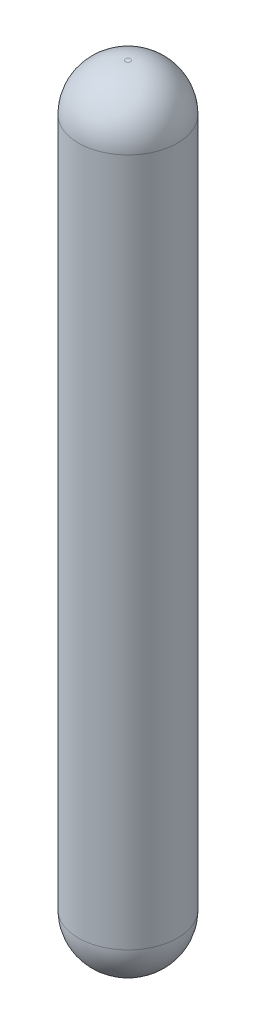
ISO-10303-21;
HEADER;
FILE_DESCRIPTION(('STEP AP214'),'2;1');
FILE_NAME('part.step','',(''),(''),'','','');
FILE_SCHEMA(('AUTOMOTIVE_DESIGN { 1 0 10303 214 1 1 1 1 }'));
ENDSEC;
DATA;
#1=APPLICATION_CONTEXT('core data for automotive mechanical design processes');
#2=APPLICATION_PROTOCOL_DEFINITION('international standard','automotive_design',2000,#1);
#3=PRODUCT_CONTEXT('',#1,'mechanical');
#4=PRODUCT('Part','Part','',(#3));
#5=PRODUCT_RELATED_PRODUCT_CATEGORY('part','',(#4));
#6=PRODUCT_DEFINITION_FORMATION('','',#4);
#7=PRODUCT_DEFINITION_CONTEXT('part definition',#1,'design');
#8=PRODUCT_DEFINITION('design','',#6,#7);
#9=PRODUCT_DEFINITION_SHAPE('','',#8);
#10=(LENGTH_UNIT() NAMED_UNIT(*) SI_UNIT(.MILLI.,.METRE.));
#11=(NAMED_UNIT(*) PLANE_ANGLE_UNIT() SI_UNIT($,.RADIAN.));
#12=(NAMED_UNIT(*) SI_UNIT($,.STERADIAN.) SOLID_ANGLE_UNIT());
#13=UNCERTAINTY_MEASURE_WITH_UNIT(LENGTH_MEASURE(1.E-05),#10,'distance_accuracy_value','');
#14=(GEOMETRIC_REPRESENTATION_CONTEXT(3) GLOBAL_UNCERTAINTY_ASSIGNED_CONTEXT((#13)) GLOBAL_UNIT_ASSIGNED_CONTEXT((#10,
#11,#12)) REPRESENTATION_CONTEXT('',''));
#15=CARTESIAN_POINT('',(0.,0.,0.));
#16=DIRECTION('',(0.,0.,1.));
#17=DIRECTION('',(1.,0.,0.));
#18=AXIS2_PLACEMENT_3D('',#15,#16,#17);
#19=CARTESIAN_POINT('',(0.,60.,0.));
#20=DIRECTION('',(0.,-1.,0.));
#21=DIRECTION('',(0.,0.,-1.));
#22=AXIS2_PLACEMENT_3D('',#19,#20,#21);
#23=CYLINDRICAL_SURFACE('',#22,3.8);
#24=CARTESIAN_POINT('',(0.,3.6,0.));
#25=DIRECTION('',(0.,1.,0.));
#26=DIRECTION('',(0.,0.,1.));
#27=AXIS2_PLACEMENT_3D('',#24,#25,#26);
#28=CIRCLE('',#27,3.8);
#29=CARTESIAN_POINT('',(0.,3.6,3.8));
#30=VERTEX_POINT('',#29);
#31=EDGE_CURVE('E48',#30,#30,#28,.T.);
#32=ORIENTED_EDGE('',*,*,#31,.T.);
#33=EDGE_LOOP('',(#32));
#34=FACE_BOUND('',#33,.T.);
#35=CARTESIAN_POINT('',(0.,56.4,0.));
#36=DIRECTION('',(0.,1.,0.));
#37=DIRECTION('',(0.,0.,1.));
#38=AXIS2_PLACEMENT_3D('',#35,#36,#37);
#39=CIRCLE('',#38,3.8);
#40=CARTESIAN_POINT('',(0.,56.4,3.8));
#41=VERTEX_POINT('',#40);
#42=EDGE_CURVE('E55',#41,#41,#39,.F.);
#43=ORIENTED_EDGE('',*,*,#42,.T.);
#44=EDGE_LOOP('',(#43));
#45=FACE_BOUND('',#44,.T.);
#46=ADVANCED_FACE('F40',(#34,#45),#23,.T.);
#47=CARTESIAN_POINT('',(0.,60.,0.));
#48=DIRECTION('',(0.,1.,0.));
#49=DIRECTION('',(0.,0.,1.));
#50=AXIS2_PLACEMENT_3D('',#47,#48,#49);
#51=PLANE('',#50);
#52=CARTESIAN_POINT('',(0.,60.,0.));
#53=DIRECTION('',(0.,1.,0.));
#54=DIRECTION('',(0.,0.,1.));
#55=AXIS2_PLACEMENT_3D('',#52,#53,#54);
#56=CIRCLE('',#55,0.2);
#57=CARTESIAN_POINT('',(0.,60.,0.2));
#58=VERTEX_POINT('',#57);
#59=EDGE_CURVE('E10',#58,#58,#56,.T.);
#60=ORIENTED_EDGE('',*,*,#59,.T.);
#61=EDGE_LOOP('',(#60));
#62=FACE_BOUND('',#61,.T.);
#63=ADVANCED_FACE('F70',(#62),#51,.T.);
#64=CARTESIAN_POINT('',(0.,0.,0.));
#65=DIRECTION('',(0.,1.,0.));
#66=DIRECTION('',(0.,0.,1.));
#67=AXIS2_PLACEMENT_3D('',#64,#65,#66);
#68=PLANE('',#67);
#69=CARTESIAN_POINT('',(0.,0.,0.));
#70=DIRECTION('',(0.,1.,0.));
#71=DIRECTION('',(0.,0.,1.));
#72=AXIS2_PLACEMENT_3D('',#69,#70,#71);
#73=CIRCLE('',#72,0.2);
#74=CARTESIAN_POINT('',(0.,0.,0.2));
#75=VERTEX_POINT('',#74);
#76=EDGE_CURVE('E42',#75,#75,#73,.F.);
#77=ORIENTED_EDGE('',*,*,#76,.T.);
#78=EDGE_LOOP('',(#77));
#79=FACE_BOUND('',#78,.T.);
#80=ADVANCED_FACE('F63',(#79),#68,.F.);
#81=CARTESIAN_POINT('',(0.,3.6,0.));
#82=DIRECTION('',(0.,1.,0.));
#83=DIRECTION('',(0.,0.,1.));
#84=AXIS2_PLACEMENT_3D('',#81,#82,#83);
#85=DEGENERATE_TOROIDAL_SURFACE('',#84,0.2,3.6,.T.);
#86=ORIENTED_EDGE('',*,*,#76,.F.);
#87=EDGE_LOOP('',(#86));
#88=FACE_BOUND('',#87,.T.);
#89=ORIENTED_EDGE('',*,*,#31,.F.);
#90=EDGE_LOOP('',(#89));
#91=FACE_BOUND('',#90,.T.);
#92=ADVANCED_FACE('F62',(#88,#91),#85,.T.);
#93=CARTESIAN_POINT('',(0.,56.4,0.));
#94=DIRECTION('',(0.,1.,0.));
#95=DIRECTION('',(0.,0.,1.));
#96=AXIS2_PLACEMENT_3D('',#93,#94,#95);
#97=DEGENERATE_TOROIDAL_SURFACE('',#96,0.2,3.6,.T.);
#98=ORIENTED_EDGE('',*,*,#42,.F.);
#99=EDGE_LOOP('',(#98));
#100=FACE_BOUND('',#99,.T.);
#101=ORIENTED_EDGE('',*,*,#59,.F.);
#102=EDGE_LOOP('',(#101));
#103=FACE_BOUND('',#102,.T.);
#104=ADVANCED_FACE('F39',(#100,#103),#97,.T.);
#105=CLOSED_SHELL('',(#46,#63,#80,#92,#104));
#106=MANIFOLD_SOLID_BREP('B2',#105);
#107=ADVANCED_BREP_SHAPE_REPRESENTATION('',(#18,#106),#14);
#108=SHAPE_DEFINITION_REPRESENTATION(#9,#107);
ENDSEC;
END-ISO-10303-21;
